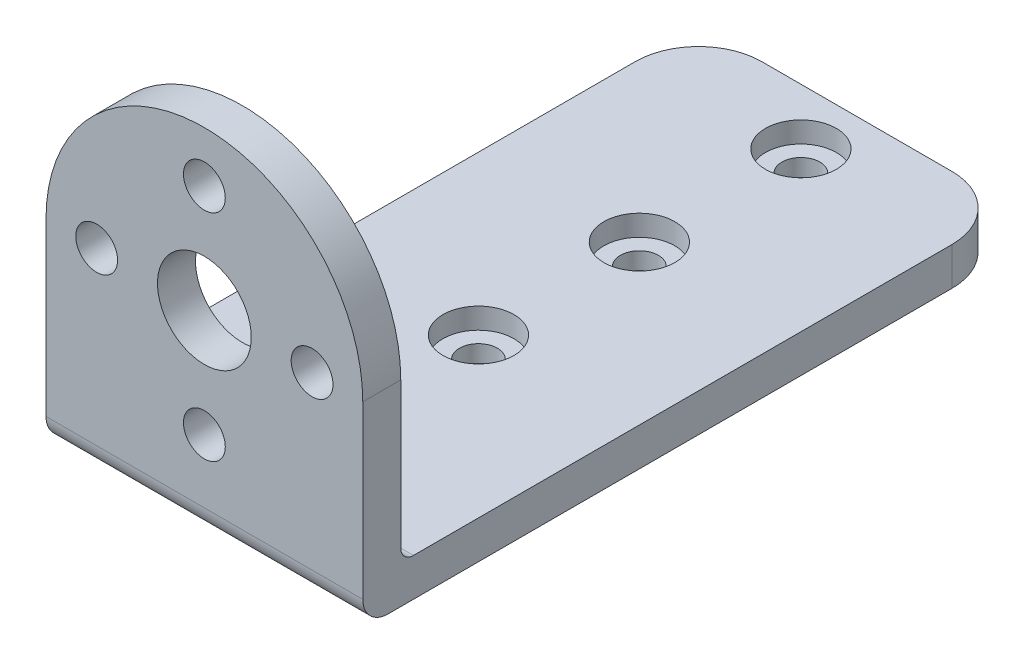
ISO-10303-21;
HEADER;
FILE_DESCRIPTION(('STEP AP214'),'2;1');
FILE_NAME('part.step','',(''),(''),'','','');
FILE_SCHEMA(('AUTOMOTIVE_DESIGN { 1 0 10303 214 1 1 1 1 }'));
ENDSEC;
DATA;
#1=APPLICATION_CONTEXT('core data for automotive mechanical design processes');
#2=APPLICATION_PROTOCOL_DEFINITION('international standard','automotive_design',2000,#1);
#3=PRODUCT_CONTEXT('',#1,'mechanical');
#4=PRODUCT('Part','Part','',(#3));
#5=PRODUCT_RELATED_PRODUCT_CATEGORY('part','',(#4));
#6=PRODUCT_DEFINITION_FORMATION('','',#4);
#7=PRODUCT_DEFINITION_CONTEXT('part definition',#1,'design');
#8=PRODUCT_DEFINITION('design','',#6,#7);
#9=PRODUCT_DEFINITION_SHAPE('','',#8);
#10=(LENGTH_UNIT() NAMED_UNIT(*) SI_UNIT(.MILLI.,.METRE.));
#11=(NAMED_UNIT(*) PLANE_ANGLE_UNIT() SI_UNIT($,.RADIAN.));
#12=(NAMED_UNIT(*) SI_UNIT($,.STERADIAN.) SOLID_ANGLE_UNIT());
#13=UNCERTAINTY_MEASURE_WITH_UNIT(LENGTH_MEASURE(1.E-05),#10,'distance_accuracy_value','');
#14=(GEOMETRIC_REPRESENTATION_CONTEXT(3) GLOBAL_UNCERTAINTY_ASSIGNED_CONTEXT((#13)) GLOBAL_UNIT_ASSIGNED_CONTEXT((#10,
#11,#12)) REPRESENTATION_CONTEXT('',''));
#15=CARTESIAN_POINT('',(0.,0.,0.));
#16=DIRECTION('',(0.,0.,1.));
#17=DIRECTION('',(1.,0.,0.));
#18=AXIS2_PLACEMENT_3D('',#15,#16,#17);
#19=CARTESIAN_POINT('',(12.5000000000001,-22.,-34.33));
#20=DIRECTION('',(0.,1.,0.));
#21=DIRECTION('',(0.,0.,1.));
#22=AXIS2_PLACEMENT_3D('',#19,#20,#21);
#23=CYLINDRICAL_SURFACE('',#22,1.5);
#24=CARTESIAN_POINT('',(12.5000000000001,0.,-34.33));
#25=DIRECTION('',(0.,-1.,0.));
#26=DIRECTION('',(0.,0.,-1.));
#27=AXIS2_PLACEMENT_3D('',#24,#25,#26);
#28=CIRCLE('',#27,1.5);
#29=CARTESIAN_POINT('',(12.5000000000001,0.,-35.83));
#30=VERTEX_POINT('',#29);
#31=EDGE_CURVE('E221',#30,#30,#28,.T.);
#32=ORIENTED_EDGE('',*,*,#31,.T.);
#33=EDGE_LOOP('',(#32));
#34=FACE_BOUND('',#33,.T.);
#35=CARTESIAN_POINT('',(12.5000000000001,1.35,-34.33));
#36=DIRECTION('',(0.,1.,0.));
#37=DIRECTION('',(0.,0.,1.));
#38=AXIS2_PLACEMENT_3D('',#35,#36,#37);
#39=CIRCLE('',#38,1.5);
#40=CARTESIAN_POINT('',(12.5000000000001,1.35,-32.83));
#41=VERTEX_POINT('',#40);
#42=EDGE_CURVE('E127',#41,#41,#39,.F.);
#43=ORIENTED_EDGE('',*,*,#42,.F.);
#44=EDGE_LOOP('',(#43));
#45=FACE_BOUND('',#44,.T.);
#46=ADVANCED_FACE('F123',(#34,#45),#23,.F.);
#47=CARTESIAN_POINT('',(12.5000000000003,-22.,-21.63));
#48=DIRECTION('',(0.,1.,0.));
#49=DIRECTION('',(0.,0.,1.));
#50=AXIS2_PLACEMENT_3D('',#47,#48,#49);
#51=CYLINDRICAL_SURFACE('',#50,1.5);
#52=CARTESIAN_POINT('',(12.5000000000003,0.,-21.63));
#53=DIRECTION('',(0.,-1.,0.));
#54=DIRECTION('',(0.,0.,-1.));
#55=AXIS2_PLACEMENT_3D('',#52,#53,#54);
#56=CIRCLE('',#55,1.5);
#57=CARTESIAN_POINT('',(12.5000000000003,0.,-23.13));
#58=VERTEX_POINT('',#57);
#59=EDGE_CURVE('E265',#58,#58,#56,.T.);
#60=ORIENTED_EDGE('',*,*,#59,.T.);
#61=EDGE_LOOP('',(#60));
#62=FACE_BOUND('',#61,.T.);
#63=CARTESIAN_POINT('',(12.5000000000003,1.35,-21.63));
#64=DIRECTION('',(0.,1.,0.));
#65=DIRECTION('',(0.,0.,1.));
#66=AXIS2_PLACEMENT_3D('',#63,#64,#65);
#67=CIRCLE('',#66,1.5);
#68=CARTESIAN_POINT('',(12.5000000000003,1.35,-20.13));
#69=VERTEX_POINT('',#68);
#70=EDGE_CURVE('E298',#69,#69,#67,.F.);
#71=ORIENTED_EDGE('',*,*,#70,.F.);
#72=EDGE_LOOP('',(#71));
#73=FACE_BOUND('',#72,.T.);
#74=ADVANCED_FACE('F348',(#62,#73),#51,.F.);
#75=CARTESIAN_POINT('',(12.5000000000004,-22.,-8.92999999999999));
#76=DIRECTION('',(0.,1.,0.));
#77=DIRECTION('',(0.,0.,1.));
#78=AXIS2_PLACEMENT_3D('',#75,#76,#77);
#79=CYLINDRICAL_SURFACE('',#78,1.5);
#80=CARTESIAN_POINT('',(12.5000000000004,0.,-8.92999999999999));
#81=DIRECTION('',(0.,-1.,0.));
#82=DIRECTION('',(0.,0.,-1.));
#83=AXIS2_PLACEMENT_3D('',#80,#81,#82);
#84=CIRCLE('',#83,1.5);
#85=CARTESIAN_POINT('',(12.5000000000004,0.,-10.43));
#86=VERTEX_POINT('',#85);
#87=EDGE_CURVE('E268',#86,#86,#84,.T.);
#88=ORIENTED_EDGE('',*,*,#87,.T.);
#89=EDGE_LOOP('',(#88));
#90=FACE_BOUND('',#89,.T.);
#91=CARTESIAN_POINT('',(12.5000000000004,1.35,-8.92999999999999));
#92=DIRECTION('',(0.,1.,0.));
#93=DIRECTION('',(0.,0.,1.));
#94=AXIS2_PLACEMENT_3D('',#91,#92,#93);
#95=CIRCLE('',#94,1.5);
#96=CARTESIAN_POINT('',(12.5000000000004,1.35,-7.42999999999999));
#97=VERTEX_POINT('',#96);
#98=EDGE_CURVE('E296',#97,#97,#95,.F.);
#99=ORIENTED_EDGE('',*,*,#98,.F.);
#100=EDGE_LOOP('',(#99));
#101=FACE_BOUND('',#100,.T.);
#102=ADVANCED_FACE('F354',(#90,#101),#79,.F.);
#103=CARTESIAN_POINT('',(12.5,-22.,-47.08));
#104=DIRECTION('',(0.,1.,0.));
#105=DIRECTION('',(0.,0.,1.));
#106=AXIS2_PLACEMENT_3D('',#103,#104,#105);
#107=CYLINDRICAL_SURFACE('',#106,1.5);
#108=CARTESIAN_POINT('',(12.5,0.,-47.08));
#109=DIRECTION('',(0.,-1.,0.));
#110=DIRECTION('',(0.,0.,-1.));
#111=AXIS2_PLACEMENT_3D('',#108,#109,#110);
#112=CIRCLE('',#111,1.5);
#113=CARTESIAN_POINT('',(12.5,0.,-48.58));
#114=VERTEX_POINT('',#113);
#115=EDGE_CURVE('E271',#114,#114,#112,.T.);
#116=ORIENTED_EDGE('',*,*,#115,.T.);
#117=EDGE_LOOP('',(#116));
#118=FACE_BOUND('',#117,.T.);
#119=CARTESIAN_POINT('',(12.5,1.35,-47.08));
#120=DIRECTION('',(0.,1.,0.));
#121=DIRECTION('',(0.,0.,1.));
#122=AXIS2_PLACEMENT_3D('',#119,#120,#121);
#123=CIRCLE('',#122,1.5);
#124=CARTESIAN_POINT('',(12.5,1.35,-45.58));
#125=VERTEX_POINT('',#124);
#126=EDGE_CURVE('E274',#125,#125,#123,.F.);
#127=ORIENTED_EDGE('',*,*,#126,.F.);
#128=EDGE_LOOP('',(#127));
#129=FACE_BOUND('',#128,.T.);
#130=ADVANCED_FACE('F452',(#118,#129),#107,.F.);
#131=CARTESIAN_POINT('',(0.,3.,0.));
#132=DIRECTION('',(0.,0.,-1.));
#133=DIRECTION('',(-1.,0.,0.));
#134=AXIS2_PLACEMENT_3D('',#131,#132,#133);
#135=PLANE('',#134);
#136=CARTESIAN_POINT('',(4.,15.5,0.));
#137=DIRECTION('',(0.,0.,1.));
#138=DIRECTION('',(1.,0.,0.));
#139=AXIS2_PLACEMENT_3D('',#136,#137,#138);
#140=CIRCLE('',#139,1.65);
#141=CARTESIAN_POINT('',(5.65,15.5,0.));
#142=VERTEX_POINT('',#141);
#143=EDGE_CURVE('E282',#142,#142,#140,.T.);
#144=ORIENTED_EDGE('',*,*,#143,.F.);
#145=EDGE_LOOP('',(#144));
#146=FACE_BOUND('',#145,.T.);
#147=CARTESIAN_POINT('',(12.5,24.,0.));
#148=DIRECTION('',(0.,0.,1.));
#149=DIRECTION('',(1.,0.,0.));
#150=AXIS2_PLACEMENT_3D('',#147,#148,#149);
#151=CIRCLE('',#150,1.65);
#152=CARTESIAN_POINT('',(14.15,24.,0.));
#153=VERTEX_POINT('',#152);
#154=EDGE_CURVE('E249',#153,#153,#151,.T.);
#155=ORIENTED_EDGE('',*,*,#154,.F.);
#156=EDGE_LOOP('',(#155));
#157=FACE_BOUND('',#156,.T.);
#158=CARTESIAN_POINT('',(12.5,15.5,0.));
#159=DIRECTION('',(0.,0.,1.));
#160=DIRECTION('',(1.,0.,0.));
#161=AXIS2_PLACEMENT_3D('',#158,#159,#160);
#162=CIRCLE('',#161,3.7);
#163=CARTESIAN_POINT('',(16.2,15.5,0.));
#164=VERTEX_POINT('',#163);
#165=EDGE_CURVE('E253',#164,#164,#162,.T.);
#166=ORIENTED_EDGE('',*,*,#165,.F.);
#167=EDGE_LOOP('',(#166));
#168=FACE_BOUND('',#167,.T.);
#169=CARTESIAN_POINT('',(21.,15.5,0.));
#170=DIRECTION('',(0.,0.,1.));
#171=DIRECTION('',(1.,0.,0.));
#172=AXIS2_PLACEMENT_3D('',#169,#170,#171);
#173=CIRCLE('',#172,1.65);
#174=CARTESIAN_POINT('',(22.65,15.5,0.));
#175=VERTEX_POINT('',#174);
#176=EDGE_CURVE('E257',#175,#175,#173,.T.);
#177=ORIENTED_EDGE('',*,*,#176,.F.);
#178=EDGE_LOOP('',(#177));
#179=FACE_BOUND('',#178,.T.);
#180=CARTESIAN_POINT('',(12.5,7.,0.));
#181=DIRECTION('',(0.,0.,1.));
#182=DIRECTION('',(1.,0.,0.));
#183=AXIS2_PLACEMENT_3D('',#180,#181,#182);
#184=CIRCLE('',#183,1.65);
#185=CARTESIAN_POINT('',(14.15,7.,0.));
#186=VERTEX_POINT('',#185);
#187=EDGE_CURVE('E220',#186,#186,#184,.T.);
#188=ORIENTED_EDGE('',*,*,#187,.F.);
#189=EDGE_LOOP('',(#188));
#190=FACE_BOUND('',#189,.T.);
#191=DIRECTION('',(0.,-1.,0.));
#192=VECTOR('',#191,1.);
#193=CARTESIAN_POINT('',(0.,3.,0.));
#194=LINE('',#193,#192);
#195=CARTESIAN_POINT('',(0.,15.5,0.));
#196=VERTEX_POINT('',#195);
#197=CARTESIAN_POINT('',(0.,2.,0.));
#198=VERTEX_POINT('',#197);
#199=EDGE_CURVE('E227',#196,#198,#194,.T.);
#200=ORIENTED_EDGE('',*,*,#199,.T.);
#201=DIRECTION('',(1.,0.,0.));
#202=VECTOR('',#201,1.);
#203=CARTESIAN_POINT('',(25.,2.,0.));
#204=LINE('',#203,#202);
#205=CARTESIAN_POINT('',(25.,2.,0.));
#206=VERTEX_POINT('',#205);
#207=EDGE_CURVE('E226',#198,#206,#204,.T.);
#208=ORIENTED_EDGE('',*,*,#207,.T.);
#209=DIRECTION('',(0.,-1.,0.));
#210=VECTOR('',#209,1.);
#211=CARTESIAN_POINT('',(25.,3.,0.));
#212=LINE('',#211,#210);
#213=CARTESIAN_POINT('',(25.,15.5,0.));
#214=VERTEX_POINT('',#213);
#215=EDGE_CURVE('E217',#214,#206,#212,.T.);
#216=ORIENTED_EDGE('',*,*,#215,.F.);
#217=CARTESIAN_POINT('',(12.5,15.5,0.));
#218=DIRECTION('',(0.,0.,1.));
#219=DIRECTION('',(1.,0.,0.));
#220=AXIS2_PLACEMENT_3D('',#217,#218,#219);
#221=CIRCLE('',#220,12.5);
#222=EDGE_CURVE('E201',#214,#196,#221,.T.);
#223=ORIENTED_EDGE('',*,*,#222,.T.);
#224=EDGE_LOOP('',(#200,#208,#216,#223));
#225=FACE_BOUND('',#224,.T.);
#226=ADVANCED_FACE('F224',(#146,#157,#168,#179,#190,#225),#135,.F.);
#227=CARTESIAN_POINT('',(0.,28.,-3.));
#228=DIRECTION('',(0.,0.,1.));
#229=DIRECTION('',(1.,0.,0.));
#230=AXIS2_PLACEMENT_3D('',#227,#228,#229);
#231=PLANE('',#230);
#232=CARTESIAN_POINT('',(4.,15.5,-3.));
#233=DIRECTION('',(0.,0.,1.));
#234=DIRECTION('',(1.,0.,0.));
#235=AXIS2_PLACEMENT_3D('',#232,#233,#234);
#236=CIRCLE('',#235,1.65);
#237=CARTESIAN_POINT('',(5.65,15.5,-3.));
#238=VERTEX_POINT('',#237);
#239=EDGE_CURVE('E246',#238,#238,#236,.T.);
#240=ORIENTED_EDGE('',*,*,#239,.T.);
#241=EDGE_LOOP('',(#240));
#242=FACE_BOUND('',#241,.T.);
#243=CARTESIAN_POINT('',(12.5,24.,-3.));
#244=DIRECTION('',(0.,0.,1.));
#245=DIRECTION('',(1.,0.,0.));
#246=AXIS2_PLACEMENT_3D('',#243,#244,#245);
#247=CIRCLE('',#246,1.65);
#248=CARTESIAN_POINT('',(14.15,24.,-3.));
#249=VERTEX_POINT('',#248);
#250=EDGE_CURVE('E212',#249,#249,#247,.T.);
#251=ORIENTED_EDGE('',*,*,#250,.T.);
#252=EDGE_LOOP('',(#251));
#253=FACE_BOUND('',#252,.T.);
#254=CARTESIAN_POINT('',(12.5,15.5,-3.));
#255=DIRECTION('',(0.,0.,1.));
#256=DIRECTION('',(1.,0.,0.));
#257=AXIS2_PLACEMENT_3D('',#254,#255,#256);
#258=CIRCLE('',#257,3.7);
#259=CARTESIAN_POINT('',(16.2,15.5,-3.));
#260=VERTEX_POINT('',#259);
#261=EDGE_CURVE('E250',#260,#260,#258,.T.);
#262=ORIENTED_EDGE('',*,*,#261,.T.);
#263=EDGE_LOOP('',(#262));
#264=FACE_BOUND('',#263,.T.);
#265=CARTESIAN_POINT('',(21.,15.5,-3.));
#266=DIRECTION('',(0.,0.,1.));
#267=DIRECTION('',(1.,0.,0.));
#268=AXIS2_PLACEMENT_3D('',#265,#266,#267);
#269=CIRCLE('',#268,1.65);
#270=CARTESIAN_POINT('',(22.65,15.5,-3.));
#271=VERTEX_POINT('',#270);
#272=EDGE_CURVE('E254',#271,#271,#269,.T.);
#273=ORIENTED_EDGE('',*,*,#272,.T.);
#274=EDGE_LOOP('',(#273));
#275=FACE_BOUND('',#274,.T.);
#276=CARTESIAN_POINT('',(12.5,7.,-3.));
#277=DIRECTION('',(0.,0.,1.));
#278=DIRECTION('',(1.,0.,0.));
#279=AXIS2_PLACEMENT_3D('',#276,#277,#278);
#280=CIRCLE('',#279,1.65);
#281=CARTESIAN_POINT('',(14.15,7.,-3.));
#282=VERTEX_POINT('',#281);
#283=EDGE_CURVE('E258',#282,#282,#280,.T.);
#284=ORIENTED_EDGE('',*,*,#283,.T.);
#285=EDGE_LOOP('',(#284));
#286=FACE_BOUND('',#285,.T.);
#287=DIRECTION('',(0.,-1.,0.));
#288=VECTOR('',#287,1.);
#289=CARTESIAN_POINT('',(25.,28.,-3.));
#290=LINE('',#289,#288);
#291=CARTESIAN_POINT('',(25.,15.5,-3.));
#292=VERTEX_POINT('',#291);
#293=CARTESIAN_POINT('',(25.,4.,-3.));
#294=VERTEX_POINT('',#293);
#295=EDGE_CURVE('E219',#292,#294,#290,.T.);
#296=ORIENTED_EDGE('',*,*,#295,.T.);
#297=DIRECTION('',(-1.,0.,0.));
#298=VECTOR('',#297,1.);
#299=CARTESIAN_POINT('',(0.,4.,-3.));
#300=LINE('',#299,#298);
#301=CARTESIAN_POINT('',(0.,4.,-3.));
#302=VERTEX_POINT('',#301);
#303=EDGE_CURVE('E289',#294,#302,#300,.T.);
#304=ORIENTED_EDGE('',*,*,#303,.T.);
#305=DIRECTION('',(0.,-1.,0.));
#306=VECTOR('',#305,1.);
#307=CARTESIAN_POINT('',(0.,28.,-3.));
#308=LINE('',#307,#306);
#309=CARTESIAN_POINT('',(0.,15.5,-3.));
#310=VERTEX_POINT('',#309);
#311=EDGE_CURVE('E244',#310,#302,#308,.T.);
#312=ORIENTED_EDGE('',*,*,#311,.F.);
#313=CARTESIAN_POINT('',(12.5,15.5,-3.));
#314=DIRECTION('',(0.,0.,1.));
#315=DIRECTION('',(1.,0.,0.));
#316=AXIS2_PLACEMENT_3D('',#313,#314,#315);
#317=CIRCLE('',#316,12.5);
#318=EDGE_CURVE('E323',#292,#310,#317,.T.);
#319=ORIENTED_EDGE('',*,*,#318,.F.);
#320=EDGE_LOOP('',(#296,#304,#312,#319));
#321=FACE_BOUND('',#320,.T.);
#322=ADVANCED_FACE('F330',(#242,#253,#264,#275,#286,#321),#231,.F.);
#323=CARTESIAN_POINT('',(0.,3.,0.));
#324=DIRECTION('',(1.,0.,0.));
#325=DIRECTION('',(0.,0.,-1.));
#326=AXIS2_PLACEMENT_3D('',#323,#324,#325);
#327=PLANE('',#326);
#328=DIRECTION('',(0.,0.,1.));
#329=VECTOR('',#328,1.);
#330=CARTESIAN_POINT('',(0.,0.,0.));
#331=LINE('',#330,#329);
#332=CARTESIAN_POINT('',(0.,0.,-46.5));
#333=VERTEX_POINT('',#332);
#334=CARTESIAN_POINT('',(0.,0.,-2.));
#335=VERTEX_POINT('',#334);
#336=EDGE_CURVE('E262',#333,#335,#331,.T.);
#337=ORIENTED_EDGE('',*,*,#336,.T.);
#338=CARTESIAN_POINT('',(0.,2.,-2.));
#339=DIRECTION('',(1.,0.,0.));
#340=DIRECTION('',(0.,0.,-1.));
#341=AXIS2_PLACEMENT_3D('',#338,#339,#340);
#342=CIRCLE('',#341,2.);
#343=EDGE_CURVE('E394',#335,#198,#342,.F.);
#344=ORIENTED_EDGE('',*,*,#343,.T.);
#345=ORIENTED_EDGE('',*,*,#199,.F.);
#346=DIRECTION('',(0.,0.,1.));
#347=VECTOR('',#346,1.);
#348=CARTESIAN_POINT('',(0.,15.5,-25.));
#349=LINE('',#348,#347);
#350=EDGE_CURVE('E207',#310,#196,#349,.T.);
#351=ORIENTED_EDGE('',*,*,#350,.F.);
#352=ORIENTED_EDGE('',*,*,#311,.T.);
#353=CARTESIAN_POINT('',(0.,4.,-4.));
#354=DIRECTION('',(1.,0.,0.));
#355=DIRECTION('',(0.,0.,-1.));
#356=AXIS2_PLACEMENT_3D('',#353,#354,#355);
#357=CIRCLE('',#356,1.);
#358=CARTESIAN_POINT('',(0.,3.,-4.));
#359=VERTEX_POINT('',#358);
#360=EDGE_CURVE('E132',#302,#359,#357,.T.);
#361=ORIENTED_EDGE('',*,*,#360,.T.);
#362=DIRECTION('',(0.,0.,1.));
#363=VECTOR('',#362,1.);
#364=CARTESIAN_POINT('',(0.,3.,0.));
#365=LINE('',#364,#363);
#366=CARTESIAN_POINT('',(0.,3.,-46.5));
#367=VERTEX_POINT('',#366);
#368=EDGE_CURVE('E275',#367,#359,#365,.T.);
#369=ORIENTED_EDGE('',*,*,#368,.F.);
#370=DIRECTION('',(0.,-1.,0.));
#371=VECTOR('',#370,1.);
#372=CARTESIAN_POINT('',(0.,3.,-46.5));
#373=LINE('',#372,#371);
#374=EDGE_CURVE('E230',#367,#333,#373,.T.);
#375=ORIENTED_EDGE('',*,*,#374,.T.);
#376=EDGE_LOOP('',(#337,#344,#345,#351,#352,#361,#369,#375));
#377=FACE_BOUND('',#376,.T.);
#378=ADVANCED_FACE('F382',(#377),#327,.F.);
#379=CARTESIAN_POINT('',(0.,3.,-51.5));
#380=DIRECTION('',(0.,-1.,0.));
#381=DIRECTION('',(0.,0.,-1.));
#382=AXIS2_PLACEMENT_3D('',#379,#380,#381);
#383=PLANE('',#382);
#384=CARTESIAN_POINT('',(12.5000000000001,3.,-34.33));
#385=DIRECTION('',(0.,1.,0.));
#386=DIRECTION('',(0.,0.,1.));
#387=AXIS2_PLACEMENT_3D('',#384,#385,#386);
#388=CIRCLE('',#387,2.8);
#389=CARTESIAN_POINT('',(12.5000000000001,3.,-31.53));
#390=VERTEX_POINT('',#389);
#391=EDGE_CURVE('E465',#390,#390,#388,.T.);
#392=ORIENTED_EDGE('',*,*,#391,.F.);
#393=EDGE_LOOP('',(#392));
#394=FACE_BOUND('',#393,.T.);
#395=CARTESIAN_POINT('',(12.5000000000003,3.,-21.63));
#396=DIRECTION('',(0.,1.,0.));
#397=DIRECTION('',(0.,0.,1.));
#398=AXIS2_PLACEMENT_3D('',#395,#396,#397);
#399=CIRCLE('',#398,2.8);
#400=CARTESIAN_POINT('',(12.5000000000003,3.,-18.83));
#401=VERTEX_POINT('',#400);
#402=EDGE_CURVE('E469',#401,#401,#399,.T.);
#403=ORIENTED_EDGE('',*,*,#402,.F.);
#404=EDGE_LOOP('',(#403));
#405=FACE_BOUND('',#404,.T.);
#406=CARTESIAN_POINT('',(12.5000000000004,3.,-8.92999999999999));
#407=DIRECTION('',(0.,1.,0.));
#408=DIRECTION('',(0.,0.,1.));
#409=AXIS2_PLACEMENT_3D('',#406,#407,#408);
#410=CIRCLE('',#409,2.8);
#411=CARTESIAN_POINT('',(12.5000000000004,3.,-6.12999999999999));
#412=VERTEX_POINT('',#411);
#413=EDGE_CURVE('E473',#412,#412,#410,.T.);
#414=ORIENTED_EDGE('',*,*,#413,.F.);
#415=EDGE_LOOP('',(#414));
#416=FACE_BOUND('',#415,.T.);
#417=CARTESIAN_POINT('',(12.5,3.,-47.08));
#418=DIRECTION('',(0.,1.,0.));
#419=DIRECTION('',(0.,0.,1.));
#420=AXIS2_PLACEMENT_3D('',#417,#418,#419);
#421=CIRCLE('',#420,2.8);
#422=CARTESIAN_POINT('',(12.5,3.,-44.28));
#423=VERTEX_POINT('',#422);
#424=EDGE_CURVE('E304',#423,#423,#421,.T.);
#425=ORIENTED_EDGE('',*,*,#424,.F.);
#426=EDGE_LOOP('',(#425));
#427=FACE_BOUND('',#426,.T.);
#428=ORIENTED_EDGE('',*,*,#368,.T.);
#429=DIRECTION('',(-1.,0.,0.));
#430=VECTOR('',#429,1.);
#431=CARTESIAN_POINT('',(25.,3.,-4.));
#432=LINE('',#431,#430);
#433=CARTESIAN_POINT('',(25.,3.,-4.));
#434=VERTEX_POINT('',#433);
#435=EDGE_CURVE('E140',#359,#434,#432,.F.);
#436=ORIENTED_EDGE('',*,*,#435,.T.);
#437=DIRECTION('',(0.,0.,-1.));
#438=VECTOR('',#437,1.);
#439=CARTESIAN_POINT('',(25.,3.,0.));
#440=LINE('',#439,#438);
#441=CARTESIAN_POINT('',(25.,3.,-46.5));
#442=VERTEX_POINT('',#441);
#443=EDGE_CURVE('E233',#434,#442,#440,.T.);
#444=ORIENTED_EDGE('',*,*,#443,.T.);
#445=CARTESIAN_POINT('',(20.,3.,-46.5));
#446=DIRECTION('',(0.,-1.,0.));
#447=DIRECTION('',(0.,0.,-1.));
#448=AXIS2_PLACEMENT_3D('',#445,#446,#447);
#449=CIRCLE('',#448,5.);
#450=CARTESIAN_POINT('',(20.,3.,-51.5));
#451=VERTEX_POINT('',#450);
#452=EDGE_CURVE('E408',#442,#451,#449,.F.);
#453=ORIENTED_EDGE('',*,*,#452,.T.);
#454=DIRECTION('',(-1.,0.,0.));
#455=VECTOR('',#454,1.);
#456=CARTESIAN_POINT('',(0.,3.,-51.5));
#457=LINE('',#456,#455);
#458=CARTESIAN_POINT('',(4.99999999999999,3.,-51.5));
#459=VERTEX_POINT('',#458);
#460=EDGE_CURVE('E228',#451,#459,#457,.T.);
#461=ORIENTED_EDGE('',*,*,#460,.T.);
#462=CARTESIAN_POINT('',(4.99999999999999,3.,-46.5));
#463=DIRECTION('',(0.,-1.,0.));
#464=DIRECTION('',(0.,0.,-1.));
#465=AXIS2_PLACEMENT_3D('',#462,#463,#464);
#466=CIRCLE('',#465,5.);
#467=EDGE_CURVE('E406',#459,#367,#466,.F.);
#468=ORIENTED_EDGE('',*,*,#467,.T.);
#469=EDGE_LOOP('',(#428,#436,#444,#453,#461,#468));
#470=FACE_BOUND('',#469,.T.);
#471=ADVANCED_FACE('F434',(#394,#405,#416,#427,#470),#383,.F.);
#472=CARTESIAN_POINT('',(25.,3.,0.));
#473=DIRECTION('',(-1.,0.,0.));
#474=DIRECTION('',(0.,0.,1.));
#475=AXIS2_PLACEMENT_3D('',#472,#473,#474);
#476=PLANE('',#475);
#477=ORIENTED_EDGE('',*,*,#215,.T.);
#478=CARTESIAN_POINT('',(25.,2.,-2.));
#479=DIRECTION('',(-1.,0.,0.));
#480=DIRECTION('',(0.,0.,1.));
#481=AXIS2_PLACEMENT_3D('',#478,#479,#480);
#482=CIRCLE('',#481,2.);
#483=CARTESIAN_POINT('',(25.,0.,-2.));
#484=VERTEX_POINT('',#483);
#485=EDGE_CURVE('E398',#206,#484,#482,.F.);
#486=ORIENTED_EDGE('',*,*,#485,.T.);
#487=DIRECTION('',(0.,0.,-1.));
#488=VECTOR('',#487,1.);
#489=CARTESIAN_POINT('',(25.,0.,0.));
#490=LINE('',#489,#488);
#491=CARTESIAN_POINT('',(25.,0.,-46.5));
#492=VERTEX_POINT('',#491);
#493=EDGE_CURVE('E429',#484,#492,#490,.T.);
#494=ORIENTED_EDGE('',*,*,#493,.T.);
#495=DIRECTION('',(0.,-1.,0.));
#496=VECTOR('',#495,1.);
#497=CARTESIAN_POINT('',(25.,3.,-46.5));
#498=LINE('',#497,#496);
#499=EDGE_CURVE('E403',#492,#442,#498,.F.);
#500=ORIENTED_EDGE('',*,*,#499,.T.);
#501=ORIENTED_EDGE('',*,*,#443,.F.);
#502=CARTESIAN_POINT('',(25.,4.,-4.));
#503=DIRECTION('',(-1.,0.,0.));
#504=DIRECTION('',(0.,0.,1.));
#505=AXIS2_PLACEMENT_3D('',#502,#503,#504);
#506=CIRCLE('',#505,1.);
#507=EDGE_CURVE('E12',#434,#294,#506,.T.);
#508=ORIENTED_EDGE('',*,*,#507,.T.);
#509=ORIENTED_EDGE('',*,*,#295,.F.);
#510=DIRECTION('',(0.,0.,1.));
#511=VECTOR('',#510,1.);
#512=CARTESIAN_POINT('',(25.,15.5,-25.));
#513=LINE('',#512,#511);
#514=EDGE_CURVE('E204',#292,#214,#513,.T.);
#515=ORIENTED_EDGE('',*,*,#514,.T.);
#516=EDGE_LOOP('',(#477,#486,#494,#500,#501,#508,#509,#515));
#517=FACE_BOUND('',#516,.T.);
#518=ADVANCED_FACE('F216',(#517),#476,.F.);
#519=CARTESIAN_POINT('',(0.,3.,-51.5));
#520=DIRECTION('',(0.,0.,1.));
#521=DIRECTION('',(1.,0.,0.));
#522=AXIS2_PLACEMENT_3D('',#519,#520,#521);
#523=PLANE('',#522);
#524=DIRECTION('',(-1.,0.,0.));
#525=VECTOR('',#524,1.);
#526=CARTESIAN_POINT('',(0.,0.,-51.5));
#527=LINE('',#526,#525);
#528=CARTESIAN_POINT('',(20.,0.,-51.5));
#529=VERTEX_POINT('',#528);
#530=CARTESIAN_POINT('',(4.99999999999999,0.,-51.5));
#531=VERTEX_POINT('',#530);
#532=EDGE_CURVE('E236',#529,#531,#527,.T.);
#533=ORIENTED_EDGE('',*,*,#532,.T.);
#534=DIRECTION('',(0.,-1.,0.));
#535=VECTOR('',#534,1.);
#536=CARTESIAN_POINT('',(4.99999999999999,3.,-51.5));
#537=LINE('',#536,#535);
#538=EDGE_CURVE('E410',#531,#459,#537,.F.);
#539=ORIENTED_EDGE('',*,*,#538,.T.);
#540=ORIENTED_EDGE('',*,*,#460,.F.);
#541=DIRECTION('',(0.,-1.,0.));
#542=VECTOR('',#541,1.);
#543=CARTESIAN_POINT('',(20.,3.,-51.5));
#544=LINE('',#543,#542);
#545=EDGE_CURVE('E412',#451,#529,#544,.T.);
#546=ORIENTED_EDGE('',*,*,#545,.T.);
#547=EDGE_LOOP('',(#533,#539,#540,#546));
#548=FACE_BOUND('',#547,.T.);
#549=ADVANCED_FACE('F343',(#548),#523,.F.);
#550=CARTESIAN_POINT('',(0.,0.,-51.5));
#551=DIRECTION('',(0.,-1.,0.));
#552=DIRECTION('',(0.,0.,-1.));
#553=AXIS2_PLACEMENT_3D('',#550,#551,#552);
#554=PLANE('',#553);
#555=ORIENTED_EDGE('',*,*,#115,.F.);
#556=EDGE_LOOP('',(#555));
#557=FACE_BOUND('',#556,.T.);
#558=ORIENTED_EDGE('',*,*,#87,.F.);
#559=EDGE_LOOP('',(#558));
#560=FACE_BOUND('',#559,.T.);
#561=ORIENTED_EDGE('',*,*,#59,.F.);
#562=EDGE_LOOP('',(#561));
#563=FACE_BOUND('',#562,.T.);
#564=ORIENTED_EDGE('',*,*,#31,.F.);
#565=EDGE_LOOP('',(#564));
#566=FACE_BOUND('',#565,.T.);
#567=ORIENTED_EDGE('',*,*,#493,.F.);
#568=DIRECTION('',(1.,0.,0.));
#569=VECTOR('',#568,1.);
#570=CARTESIAN_POINT('',(0.,0.,-2.));
#571=LINE('',#570,#569);
#572=EDGE_CURVE('E395',#484,#335,#571,.F.);
#573=ORIENTED_EDGE('',*,*,#572,.T.);
#574=ORIENTED_EDGE('',*,*,#336,.F.);
#575=CARTESIAN_POINT('',(4.99999999999999,0.,-46.5));
#576=DIRECTION('',(0.,-1.,0.));
#577=DIRECTION('',(0.,0.,-1.));
#578=AXIS2_PLACEMENT_3D('',#575,#576,#577);
#579=CIRCLE('',#578,5.);
#580=EDGE_CURVE('E415',#333,#531,#579,.T.);
#581=ORIENTED_EDGE('',*,*,#580,.T.);
#582=ORIENTED_EDGE('',*,*,#532,.F.);
#583=CARTESIAN_POINT('',(20.,0.,-46.5));
#584=DIRECTION('',(0.,-1.,0.));
#585=DIRECTION('',(0.,0.,-1.));
#586=AXIS2_PLACEMENT_3D('',#583,#584,#585);
#587=CIRCLE('',#586,5.);
#588=EDGE_CURVE('E416',#529,#492,#587,.T.);
#589=ORIENTED_EDGE('',*,*,#588,.T.);
#590=EDGE_LOOP('',(#567,#573,#574,#581,#582,#589));
#591=FACE_BOUND('',#590,.T.);
#592=ADVANCED_FACE('F335',(#557,#560,#563,#566,#591),#554,.T.);
#593=CARTESIAN_POINT('',(4.,15.5,-25.));
#594=DIRECTION('',(0.,0.,1.));
#595=DIRECTION('',(1.,0.,0.));
#596=AXIS2_PLACEMENT_3D('',#593,#594,#595);
#597=CYLINDRICAL_SURFACE('',#596,1.65);
#598=ORIENTED_EDGE('',*,*,#143,.T.);
#599=EDGE_LOOP('',(#598));
#600=FACE_BOUND('',#599,.T.);
#601=ORIENTED_EDGE('',*,*,#239,.F.);
#602=EDGE_LOOP('',(#601));
#603=FACE_BOUND('',#602,.T.);
#604=ADVANCED_FACE('F333',(#600,#603),#597,.F.);
#605=CARTESIAN_POINT('',(12.5,15.5,-25.));
#606=DIRECTION('',(0.,0.,1.));
#607=DIRECTION('',(1.,0.,0.));
#608=AXIS2_PLACEMENT_3D('',#605,#606,#607);
#609=CYLINDRICAL_SURFACE('',#608,12.5);
#610=ORIENTED_EDGE('',*,*,#318,.T.);
#611=ORIENTED_EDGE('',*,*,#350,.T.);
#612=ORIENTED_EDGE('',*,*,#222,.F.);
#613=ORIENTED_EDGE('',*,*,#514,.F.);
#614=EDGE_LOOP('',(#610,#611,#612,#613));
#615=FACE_BOUND('',#614,.T.);
#616=ADVANCED_FACE('F203',(#615),#609,.T.);
#617=CARTESIAN_POINT('',(12.5,24.,-25.));
#618=DIRECTION('',(0.,0.,1.));
#619=DIRECTION('',(1.,0.,0.));
#620=AXIS2_PLACEMENT_3D('',#617,#618,#619);
#621=CYLINDRICAL_SURFACE('',#620,1.65);
#622=ORIENTED_EDGE('',*,*,#154,.T.);
#623=EDGE_LOOP('',(#622));
#624=FACE_BOUND('',#623,.T.);
#625=ORIENTED_EDGE('',*,*,#250,.F.);
#626=EDGE_LOOP('',(#625));
#627=FACE_BOUND('',#626,.T.);
#628=ADVANCED_FACE('F341',(#624,#627),#621,.F.);
#629=CARTESIAN_POINT('',(12.5,15.5,-25.));
#630=DIRECTION('',(0.,0.,1.));
#631=DIRECTION('',(1.,0.,0.));
#632=AXIS2_PLACEMENT_3D('',#629,#630,#631);
#633=CYLINDRICAL_SURFACE('',#632,3.7);
#634=ORIENTED_EDGE('',*,*,#165,.T.);
#635=EDGE_LOOP('',(#634));
#636=FACE_BOUND('',#635,.T.);
#637=ORIENTED_EDGE('',*,*,#261,.F.);
#638=EDGE_LOOP('',(#637));
#639=FACE_BOUND('',#638,.T.);
#640=ADVANCED_FACE('F368',(#636,#639),#633,.F.);
#641=CARTESIAN_POINT('',(21.,15.5,-25.));
#642=DIRECTION('',(0.,0.,1.));
#643=DIRECTION('',(1.,0.,0.));
#644=AXIS2_PLACEMENT_3D('',#641,#642,#643);
#645=CYLINDRICAL_SURFACE('',#644,1.65);
#646=ORIENTED_EDGE('',*,*,#176,.T.);
#647=EDGE_LOOP('',(#646));
#648=FACE_BOUND('',#647,.T.);
#649=ORIENTED_EDGE('',*,*,#272,.F.);
#650=EDGE_LOOP('',(#649));
#651=FACE_BOUND('',#650,.T.);
#652=ADVANCED_FACE('F364',(#648,#651),#645,.F.);
#653=CARTESIAN_POINT('',(12.5,7.,-25.));
#654=DIRECTION('',(0.,0.,1.));
#655=DIRECTION('',(1.,0.,0.));
#656=AXIS2_PLACEMENT_3D('',#653,#654,#655);
#657=CYLINDRICAL_SURFACE('',#656,1.65);
#658=ORIENTED_EDGE('',*,*,#187,.T.);
#659=EDGE_LOOP('',(#658));
#660=FACE_BOUND('',#659,.T.);
#661=ORIENTED_EDGE('',*,*,#283,.F.);
#662=EDGE_LOOP('',(#661));
#663=FACE_BOUND('',#662,.T.);
#664=ADVANCED_FACE('F360',(#660,#663),#657,.F.);
#665=CARTESIAN_POINT('',(4.99999999999999,3.,-46.5));
#666=DIRECTION('',(0.,-1.,0.));
#667=DIRECTION('',(0.,0.,-1.));
#668=AXIS2_PLACEMENT_3D('',#665,#666,#667);
#669=CYLINDRICAL_SURFACE('',#668,5.);
#670=ORIENTED_EDGE('',*,*,#467,.F.);
#671=ORIENTED_EDGE('',*,*,#538,.F.);
#672=ORIENTED_EDGE('',*,*,#580,.F.);
#673=ORIENTED_EDGE('',*,*,#374,.F.);
#674=EDGE_LOOP('',(#670,#671,#672,#673));
#675=FACE_BOUND('',#674,.T.);
#676=ADVANCED_FACE('F363',(#675),#669,.T.);
#677=CARTESIAN_POINT('',(20.,3.,-46.5));
#678=DIRECTION('',(0.,-1.,0.));
#679=DIRECTION('',(0.,0.,-1.));
#680=AXIS2_PLACEMENT_3D('',#677,#678,#679);
#681=CYLINDRICAL_SURFACE('',#680,5.);
#682=ORIENTED_EDGE('',*,*,#452,.F.);
#683=ORIENTED_EDGE('',*,*,#499,.F.);
#684=ORIENTED_EDGE('',*,*,#588,.F.);
#685=ORIENTED_EDGE('',*,*,#545,.F.);
#686=EDGE_LOOP('',(#682,#683,#684,#685));
#687=FACE_BOUND('',#686,.T.);
#688=ADVANCED_FACE('F437',(#687),#681,.T.);
#689=CARTESIAN_POINT('',(0.,2.,-2.));
#690=DIRECTION('',(-1.,0.,0.));
#691=DIRECTION('',(0.,0.,1.));
#692=AXIS2_PLACEMENT_3D('',#689,#690,#691);
#693=CYLINDRICAL_SURFACE('',#692,2.);
#694=ORIENTED_EDGE('',*,*,#343,.F.);
#695=ORIENTED_EDGE('',*,*,#572,.F.);
#696=ORIENTED_EDGE('',*,*,#485,.F.);
#697=ORIENTED_EDGE('',*,*,#207,.F.);
#698=EDGE_LOOP('',(#694,#695,#696,#697));
#699=FACE_BOUND('',#698,.T.);
#700=ADVANCED_FACE('F439',(#699),#693,.T.);
#701=CARTESIAN_POINT('',(0.,4.,-4.));
#702=DIRECTION('',(1.,0.,0.));
#703=DIRECTION('',(0.,0.,-1.));
#704=AXIS2_PLACEMENT_3D('',#701,#702,#703);
#705=CYLINDRICAL_SURFACE('',#704,1.);
#706=ORIENTED_EDGE('',*,*,#507,.F.);
#707=ORIENTED_EDGE('',*,*,#435,.F.);
#708=ORIENTED_EDGE('',*,*,#360,.F.);
#709=ORIENTED_EDGE('',*,*,#303,.F.);
#710=EDGE_LOOP('',(#706,#707,#708,#709));
#711=FACE_BOUND('',#710,.T.);
#712=ADVANCED_FACE('F125',(#711),#705,.F.);
#713=CARTESIAN_POINT('',(12.5,1.35,-47.08));
#714=DIRECTION('',(0.,1.,0.));
#715=DIRECTION('',(0.,0.,1.));
#716=AXIS2_PLACEMENT_3D('',#713,#714,#715);
#717=PLANE('',#716);
#718=CARTESIAN_POINT('',(12.5,1.35,-47.08));
#719=DIRECTION('',(0.,1.,0.));
#720=DIRECTION('',(0.,0.,1.));
#721=AXIS2_PLACEMENT_3D('',#718,#719,#720);
#722=CIRCLE('',#721,2.8);
#723=CARTESIAN_POINT('',(12.5,1.35,-44.28));
#724=VERTEX_POINT('',#723);
#725=EDGE_CURVE('E295',#724,#724,#722,.T.);
#726=ORIENTED_EDGE('',*,*,#725,.T.);
#727=EDGE_LOOP('',(#726));
#728=FACE_BOUND('',#727,.T.);
#729=ORIENTED_EDGE('',*,*,#126,.T.);
#730=EDGE_LOOP('',(#729));
#731=FACE_BOUND('',#730,.T.);
#732=ADVANCED_FACE('F515',(#728,#731),#717,.T.);
#733=CARTESIAN_POINT('',(12.5,1.35,-47.08));
#734=DIRECTION('',(0.,1.,0.));
#735=DIRECTION('',(0.,0.,1.));
#736=AXIS2_PLACEMENT_3D('',#733,#734,#735);
#737=CYLINDRICAL_SURFACE('',#736,2.8);
#738=ORIENTED_EDGE('',*,*,#725,.F.);
#739=EDGE_LOOP('',(#738));
#740=FACE_BOUND('',#739,.T.);
#741=ORIENTED_EDGE('',*,*,#424,.T.);
#742=EDGE_LOOP('',(#741));
#743=FACE_BOUND('',#742,.T.);
#744=ADVANCED_FACE('F510',(#740,#743),#737,.F.);
#745=CARTESIAN_POINT('',(12.5000000000004,1.35,-8.92999999999999));
#746=DIRECTION('',(0.,1.,0.));
#747=DIRECTION('',(0.,0.,1.));
#748=AXIS2_PLACEMENT_3D('',#745,#746,#747);
#749=PLANE('',#748);
#750=CARTESIAN_POINT('',(12.5000000000004,1.35,-8.92999999999999));
#751=DIRECTION('',(0.,1.,0.));
#752=DIRECTION('',(0.,0.,1.));
#753=AXIS2_PLACEMENT_3D('',#750,#751,#752);
#754=CIRCLE('',#753,2.8);
#755=CARTESIAN_POINT('',(12.5000000000004,1.35,-6.12999999999999));
#756=VERTEX_POINT('',#755);
#757=EDGE_CURVE('E475',#756,#756,#754,.T.);
#758=ORIENTED_EDGE('',*,*,#757,.T.);
#759=EDGE_LOOP('',(#758));
#760=FACE_BOUND('',#759,.T.);
#761=ORIENTED_EDGE('',*,*,#98,.T.);
#762=EDGE_LOOP('',(#761));
#763=FACE_BOUND('',#762,.T.);
#764=ADVANCED_FACE('F507',(#760,#763),#749,.T.);
#765=CARTESIAN_POINT('',(12.5000000000004,1.35,-8.92999999999999));
#766=DIRECTION('',(0.,1.,0.));
#767=DIRECTION('',(0.,0.,1.));
#768=AXIS2_PLACEMENT_3D('',#765,#766,#767);
#769=CYLINDRICAL_SURFACE('',#768,2.8);
#770=ORIENTED_EDGE('',*,*,#757,.F.);
#771=EDGE_LOOP('',(#770));
#772=FACE_BOUND('',#771,.T.);
#773=ORIENTED_EDGE('',*,*,#413,.T.);
#774=EDGE_LOOP('',(#773));
#775=FACE_BOUND('',#774,.T.);
#776=ADVANCED_FACE('F502',(#772,#775),#769,.F.);
#777=CARTESIAN_POINT('',(12.5000000000003,1.35,-21.63));
#778=DIRECTION('',(0.,1.,0.));
#779=DIRECTION('',(0.,0.,1.));
#780=AXIS2_PLACEMENT_3D('',#777,#778,#779);
#781=PLANE('',#780);
#782=CARTESIAN_POINT('',(12.5000000000003,1.35,-21.63));
#783=DIRECTION('',(0.,1.,0.));
#784=DIRECTION('',(0.,0.,1.));
#785=AXIS2_PLACEMENT_3D('',#782,#783,#784);
#786=CIRCLE('',#785,2.8);
#787=CARTESIAN_POINT('',(12.5000000000003,1.35,-18.83));
#788=VERTEX_POINT('',#787);
#789=EDGE_CURVE('E480',#788,#788,#786,.T.);
#790=ORIENTED_EDGE('',*,*,#789,.T.);
#791=EDGE_LOOP('',(#790));
#792=FACE_BOUND('',#791,.T.);
#793=ORIENTED_EDGE('',*,*,#70,.T.);
#794=EDGE_LOOP('',(#793));
#795=FACE_BOUND('',#794,.T.);
#796=ADVANCED_FACE('F499',(#792,#795),#781,.T.);
#797=CARTESIAN_POINT('',(12.5000000000003,1.35,-21.63));
#798=DIRECTION('',(0.,1.,0.));
#799=DIRECTION('',(0.,0.,1.));
#800=AXIS2_PLACEMENT_3D('',#797,#798,#799);
#801=CYLINDRICAL_SURFACE('',#800,2.8);
#802=ORIENTED_EDGE('',*,*,#789,.F.);
#803=EDGE_LOOP('',(#802));
#804=FACE_BOUND('',#803,.T.);
#805=ORIENTED_EDGE('',*,*,#402,.T.);
#806=EDGE_LOOP('',(#805));
#807=FACE_BOUND('',#806,.T.);
#808=ADVANCED_FACE('F496',(#804,#807),#801,.F.);
#809=CARTESIAN_POINT('',(12.5000000000001,1.35,-34.33));
#810=DIRECTION('',(0.,1.,0.));
#811=DIRECTION('',(0.,0.,1.));
#812=AXIS2_PLACEMENT_3D('',#809,#810,#811);
#813=PLANE('',#812);
#814=CARTESIAN_POINT('',(12.5000000000001,1.35,-34.33));
#815=DIRECTION('',(0.,1.,0.));
#816=DIRECTION('',(0.,0.,1.));
#817=AXIS2_PLACEMENT_3D('',#814,#815,#816);
#818=CIRCLE('',#817,2.8);
#819=CARTESIAN_POINT('',(12.5000000000001,1.35,-31.53));
#820=VERTEX_POINT('',#819);
#821=EDGE_CURVE('E299',#820,#820,#818,.T.);
#822=ORIENTED_EDGE('',*,*,#821,.T.);
#823=EDGE_LOOP('',(#822));
#824=FACE_BOUND('',#823,.T.);
#825=ORIENTED_EDGE('',*,*,#42,.T.);
#826=EDGE_LOOP('',(#825));
#827=FACE_BOUND('',#826,.T.);
#828=ADVANCED_FACE('F487',(#824,#827),#813,.T.);
#829=CARTESIAN_POINT('',(12.5000000000001,1.35,-34.33));
#830=DIRECTION('',(0.,1.,0.));
#831=DIRECTION('',(0.,0.,1.));
#832=AXIS2_PLACEMENT_3D('',#829,#830,#831);
#833=CYLINDRICAL_SURFACE('',#832,2.8);
#834=ORIENTED_EDGE('',*,*,#821,.F.);
#835=EDGE_LOOP('',(#834));
#836=FACE_BOUND('',#835,.T.);
#837=ORIENTED_EDGE('',*,*,#391,.T.);
#838=EDGE_LOOP('',(#837));
#839=FACE_BOUND('',#838,.T.);
#840=ADVANCED_FACE('F489',(#836,#839),#833,.F.);
#841=CLOSED_SHELL('',(#46,#74,#102,#130,#226,#322,#378,#471,#518,#549,#592,#604,#616,#628,#640,
#652,#664,#676,#688,#700,#712,#732,#744,#764,#776,#796,#808,#828,#840));
#842=MANIFOLD_SOLID_BREP('B2',#841);
#843=ADVANCED_BREP_SHAPE_REPRESENTATION('',(#18,#842),#14);
#844=SHAPE_DEFINITION_REPRESENTATION(#9,#843);
ENDSEC;
END-ISO-10303-21;
